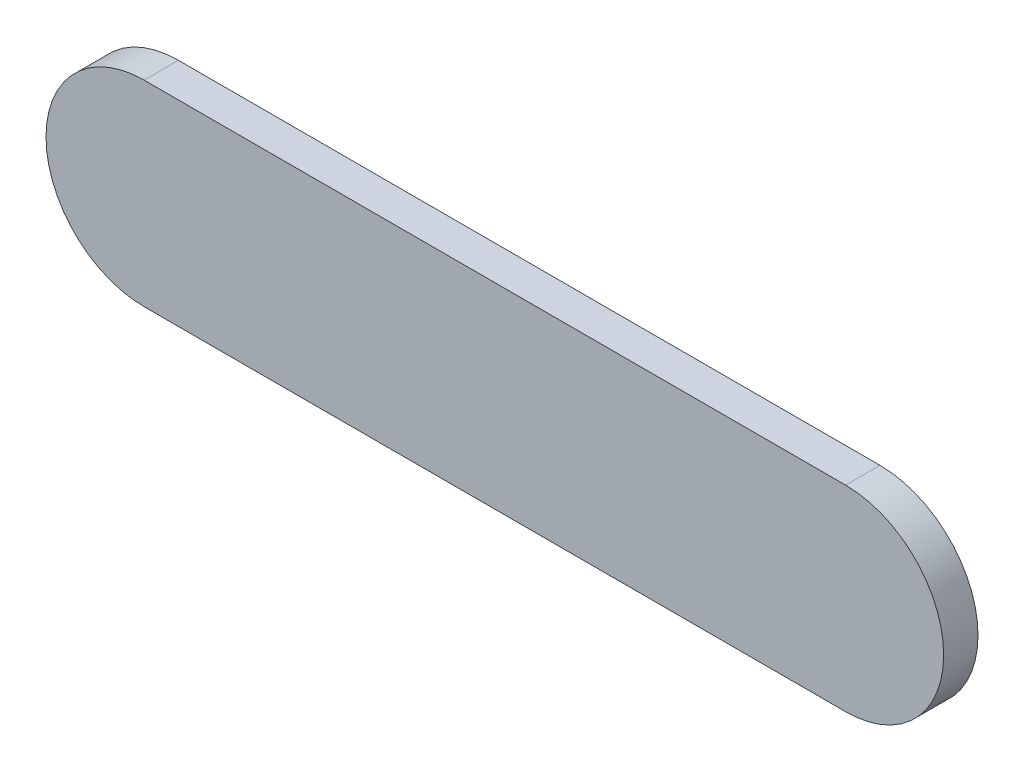
ISO-10303-21;
HEADER;
FILE_DESCRIPTION(('STEP AP214'),'2;1');
FILE_NAME('part.step','',(''),(''),'','','');
FILE_SCHEMA(('AUTOMOTIVE_DESIGN { 1 0 10303 214 1 1 1 1 }'));
ENDSEC;
DATA;
#1=APPLICATION_CONTEXT('core data for automotive mechanical design processes');
#2=APPLICATION_PROTOCOL_DEFINITION('international standard','automotive_design',2000,#1);
#3=PRODUCT_CONTEXT('',#1,'mechanical');
#4=PRODUCT('Part','Part','',(#3));
#5=PRODUCT_RELATED_PRODUCT_CATEGORY('part','',(#4));
#6=PRODUCT_DEFINITION_FORMATION('','',#4);
#7=PRODUCT_DEFINITION_CONTEXT('part definition',#1,'design');
#8=PRODUCT_DEFINITION('design','',#6,#7);
#9=PRODUCT_DEFINITION_SHAPE('','',#8);
#10=(LENGTH_UNIT() NAMED_UNIT(*) SI_UNIT(.MILLI.,.METRE.));
#11=(NAMED_UNIT(*) PLANE_ANGLE_UNIT() SI_UNIT($,.RADIAN.));
#12=(NAMED_UNIT(*) SI_UNIT($,.STERADIAN.) SOLID_ANGLE_UNIT());
#13=UNCERTAINTY_MEASURE_WITH_UNIT(LENGTH_MEASURE(1.E-05),#10,'distance_accuracy_value','');
#14=(GEOMETRIC_REPRESENTATION_CONTEXT(3) GLOBAL_UNCERTAINTY_ASSIGNED_CONTEXT((#13)) GLOBAL_UNIT_ASSIGNED_CONTEXT((#10,
#11,#12)) REPRESENTATION_CONTEXT('',''));
#15=CARTESIAN_POINT('',(0.,0.,0.));
#16=DIRECTION('',(0.,0.,1.));
#17=DIRECTION('',(1.,0.,0.));
#18=AXIS2_PLACEMENT_3D('',#15,#16,#17);
#19=CARTESIAN_POINT('',(89.7,-141.685,1.635));
#20=DIRECTION('',(0.,0.,1.));
#21=DIRECTION('',(1.,0.,0.));
#22=AXIS2_PLACEMENT_3D('',#19,#20,#21);
#23=PLANE('',#22);
#24=DIRECTION('',(1.,0.,0.));
#25=VECTOR('',#24,1.);
#26=CARTESIAN_POINT('',(89.7,-141.685,1.635));
#27=LINE('',#26,#25);
#28=CARTESIAN_POINT('',(89.7,-141.685,1.635));
#29=VERTEX_POINT('',#28);
#30=CARTESIAN_POINT('',(90.415,-141.685,1.635));
#31=VERTEX_POINT('',#30);
#32=EDGE_CURVE('E90',#29,#31,#27,.T.);
#33=ORIENTED_EDGE('',*,*,#32,.T.);
#34=CARTESIAN_POINT('',(90.415,-141.585,1.635));
#35=DIRECTION('',(0.,0.,1.));
#36=DIRECTION('',(-1.42108547152E-13,-1.,0.));
#37=AXIS2_PLACEMENT_3D('',#34,#35,#36);
#38=CIRCLE('',#37,0.09999999999999);
#39=CARTESIAN_POINT('',(90.415,-141.485,1.635));
#40=VERTEX_POINT('',#39);
#41=EDGE_CURVE('E85',#31,#40,#38,.T.);
#42=ORIENTED_EDGE('',*,*,#41,.T.);
#43=DIRECTION('',(-1.,0.,0.));
#44=VECTOR('',#43,1.);
#45=CARTESIAN_POINT('',(90.415,-141.485,1.635));
#46=LINE('',#45,#44);
#47=CARTESIAN_POINT('',(89.7,-141.485,1.635));
#48=VERTEX_POINT('',#47);
#49=EDGE_CURVE('E104',#40,#48,#46,.T.);
#50=ORIENTED_EDGE('',*,*,#49,.T.);
#51=CARTESIAN_POINT('',(89.7,-141.585,1.635));
#52=DIRECTION('',(0.,0.,1.));
#53=DIRECTION('',(1.42108547152E-13,1.,0.));
#54=AXIS2_PLACEMENT_3D('',#51,#52,#53);
#55=CIRCLE('',#54,0.09999999999999);
#56=EDGE_CURVE('E11',#48,#29,#55,.T.);
#57=ORIENTED_EDGE('',*,*,#56,.T.);
#58=EDGE_LOOP('',(#33,#42,#50,#57));
#59=FACE_BOUND('',#58,.T.);
#60=ADVANCED_FACE('F17',(#59),#23,.T.);
#61=CARTESIAN_POINT('',(89.7,-141.685,1.6));
#62=DIRECTION('',(0.,0.,1.));
#63=DIRECTION('',(1.,0.,0.));
#64=AXIS2_PLACEMENT_3D('',#61,#62,#63);
#65=PLANE('',#64);
#66=CARTESIAN_POINT('',(89.7,-141.585,1.6));
#67=DIRECTION('',(0.,0.,1.));
#68=DIRECTION('',(1.42108547152E-13,1.,0.));
#69=AXIS2_PLACEMENT_3D('',#66,#67,#68);
#70=CIRCLE('',#69,0.09999999999999);
#71=CARTESIAN_POINT('',(89.7,-141.485,1.6));
#72=VERTEX_POINT('',#71);
#73=CARTESIAN_POINT('',(89.7,-141.685,1.6));
#74=VERTEX_POINT('',#73);
#75=EDGE_CURVE('E26',#72,#74,#70,.T.);
#76=ORIENTED_EDGE('',*,*,#75,.F.);
#77=DIRECTION('',(-1.,0.,0.));
#78=VECTOR('',#77,1.);
#79=CARTESIAN_POINT('',(90.415,-141.485,1.6));
#80=LINE('',#79,#78);
#81=CARTESIAN_POINT('',(90.415,-141.485,1.6));
#82=VERTEX_POINT('',#81);
#83=EDGE_CURVE('E73',#82,#72,#80,.T.);
#84=ORIENTED_EDGE('',*,*,#83,.F.);
#85=CARTESIAN_POINT('',(90.415,-141.585,1.6));
#86=DIRECTION('',(0.,0.,1.));
#87=DIRECTION('',(-1.42108547152E-13,-1.,0.));
#88=AXIS2_PLACEMENT_3D('',#85,#86,#87);
#89=CIRCLE('',#88,0.09999999999999);
#90=CARTESIAN_POINT('',(90.415,-141.685,1.6));
#91=VERTEX_POINT('',#90);
#92=EDGE_CURVE('E68',#91,#82,#89,.T.);
#93=ORIENTED_EDGE('',*,*,#92,.F.);
#94=DIRECTION('',(1.,0.,0.));
#95=VECTOR('',#94,1.);
#96=CARTESIAN_POINT('',(89.7,-141.685,1.6));
#97=LINE('',#96,#95);
#98=EDGE_CURVE('E71',#74,#91,#97,.T.);
#99=ORIENTED_EDGE('',*,*,#98,.F.);
#100=EDGE_LOOP('',(#76,#84,#93,#99));
#101=FACE_BOUND('',#100,.T.);
#102=ADVANCED_FACE('F19',(#101),#65,.F.);
#103=CARTESIAN_POINT('',(89.7,-141.585,1.6));
#104=DIRECTION('',(0.,0.,-1.));
#105=DIRECTION('',(1.42108547152E-13,1.,0.));
#106=AXIS2_PLACEMENT_3D('',#103,#104,#105);
#107=CYLINDRICAL_SURFACE('',#106,0.09999999999999);
#108=ORIENTED_EDGE('',*,*,#75,.T.);
#109=DIRECTION('',(0.,0.,1.));
#110=VECTOR('',#109,1.);
#111=CARTESIAN_POINT('',(89.7,-141.685,1.6));
#112=LINE('',#111,#110);
#113=EDGE_CURVE('E79',#74,#29,#112,.T.);
#114=ORIENTED_EDGE('',*,*,#113,.T.);
#115=ORIENTED_EDGE('',*,*,#56,.F.);
#116=DIRECTION('',(0.,0.,1.));
#117=VECTOR('',#116,1.);
#118=CARTESIAN_POINT('',(89.7,-141.485,1.6));
#119=LINE('',#118,#117);
#120=EDGE_CURVE('E100',#72,#48,#119,.T.);
#121=ORIENTED_EDGE('',*,*,#120,.F.);
#122=EDGE_LOOP('',(#108,#114,#115,#121));
#123=FACE_BOUND('',#122,.T.);
#124=ADVANCED_FACE('F119',(#123),#107,.T.);
#125=CARTESIAN_POINT('',(90.415,-141.485,1.6));
#126=DIRECTION('',(0.,-1.,0.));
#127=DIRECTION('',(0.,0.,-1.));
#128=AXIS2_PLACEMENT_3D('',#125,#126,#127);
#129=PLANE('',#128);
#130=ORIENTED_EDGE('',*,*,#83,.T.);
#131=ORIENTED_EDGE('',*,*,#120,.T.);
#132=ORIENTED_EDGE('',*,*,#49,.F.);
#133=DIRECTION('',(0.,0.,1.));
#134=VECTOR('',#133,1.);
#135=CARTESIAN_POINT('',(90.415,-141.485,1.6));
#136=LINE('',#135,#134);
#137=EDGE_CURVE('E78',#82,#40,#136,.T.);
#138=ORIENTED_EDGE('',*,*,#137,.F.);
#139=EDGE_LOOP('',(#130,#131,#132,#138));
#140=FACE_BOUND('',#139,.T.);
#141=ADVANCED_FACE('F121',(#140),#129,.F.);
#142=CARTESIAN_POINT('',(90.415,-141.585,1.6));
#143=DIRECTION('',(0.,0.,-1.));
#144=DIRECTION('',(-1.42108547152E-13,-1.,0.));
#145=AXIS2_PLACEMENT_3D('',#142,#143,#144);
#146=CYLINDRICAL_SURFACE('',#145,0.09999999999999);
#147=ORIENTED_EDGE('',*,*,#92,.T.);
#148=ORIENTED_EDGE('',*,*,#137,.T.);
#149=ORIENTED_EDGE('',*,*,#41,.F.);
#150=DIRECTION('',(0.,0.,1.));
#151=VECTOR('',#150,1.);
#152=CARTESIAN_POINT('',(90.415,-141.685,1.6));
#153=LINE('',#152,#151);
#154=EDGE_CURVE('E82',#91,#31,#153,.T.);
#155=ORIENTED_EDGE('',*,*,#154,.F.);
#156=EDGE_LOOP('',(#147,#148,#149,#155));
#157=FACE_BOUND('',#156,.T.);
#158=ADVANCED_FACE('F83',(#157),#146,.T.);
#159=CARTESIAN_POINT('',(89.7,-141.685,1.6));
#160=DIRECTION('',(0.,1.,0.));
#161=DIRECTION('',(1.,0.,0.));
#162=AXIS2_PLACEMENT_3D('',#159,#160,#161);
#163=PLANE('',#162);
#164=ORIENTED_EDGE('',*,*,#98,.T.);
#165=ORIENTED_EDGE('',*,*,#154,.T.);
#166=ORIENTED_EDGE('',*,*,#32,.F.);
#167=ORIENTED_EDGE('',*,*,#113,.F.);
#168=EDGE_LOOP('',(#164,#165,#166,#167));
#169=FACE_BOUND('',#168,.T.);
#170=ADVANCED_FACE('F93',(#169),#163,.F.);
#171=CLOSED_SHELL('',(#60,#102,#124,#141,#158,#170));
#172=MANIFOLD_SOLID_BREP('B1',#171);
#173=ADVANCED_BREP_SHAPE_REPRESENTATION('',(#18,#172),#14);
#174=SHAPE_DEFINITION_REPRESENTATION(#9,#173);
ENDSEC;
END-ISO-10303-21;
